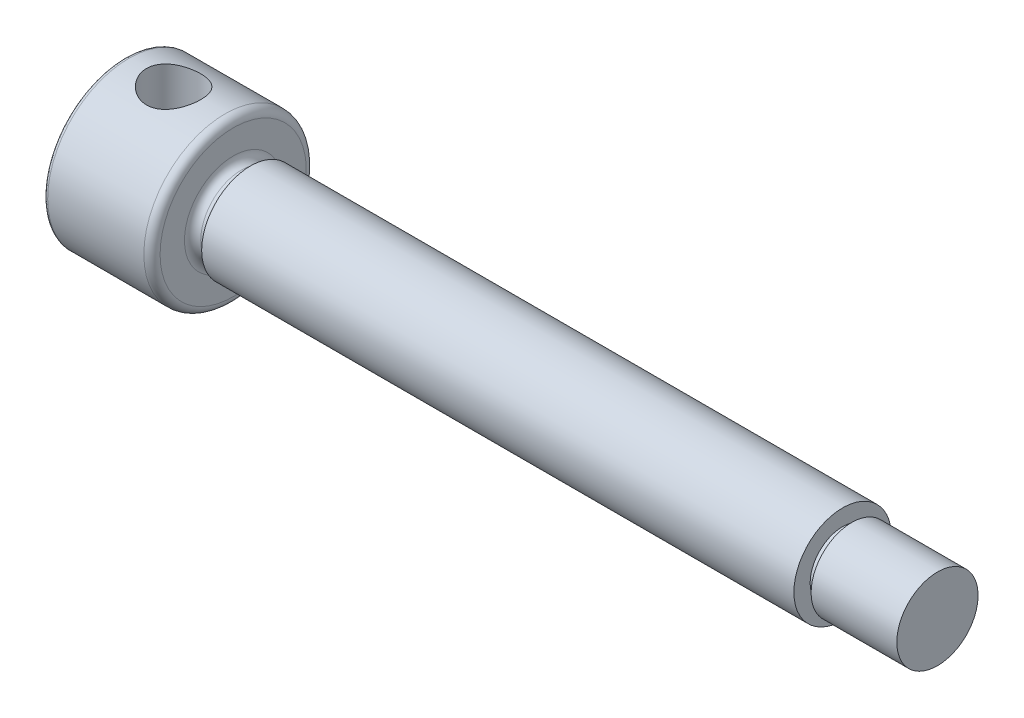
ISO-10303-21;
HEADER;
FILE_DESCRIPTION(('STEP AP214'),'2;1');
FILE_NAME('part.step','',(''),(''),'','','');
FILE_SCHEMA(('AUTOMOTIVE_DESIGN { 1 0 10303 214 1 1 1 1 }'));
ENDSEC;
DATA;
#1=APPLICATION_CONTEXT('core data for automotive mechanical design processes');
#2=APPLICATION_PROTOCOL_DEFINITION('international standard','automotive_design',2000,#1);
#3=PRODUCT_CONTEXT('',#1,'mechanical');
#4=PRODUCT('Part','Part','',(#3));
#5=PRODUCT_RELATED_PRODUCT_CATEGORY('part','',(#4));
#6=PRODUCT_DEFINITION_FORMATION('','',#4);
#7=PRODUCT_DEFINITION_CONTEXT('part definition',#1,'design');
#8=PRODUCT_DEFINITION('design','',#6,#7);
#9=PRODUCT_DEFINITION_SHAPE('','',#8);
#10=(LENGTH_UNIT() NAMED_UNIT(*) SI_UNIT(.MILLI.,.METRE.));
#11=(NAMED_UNIT(*) PLANE_ANGLE_UNIT() SI_UNIT($,.RADIAN.));
#12=(NAMED_UNIT(*) SI_UNIT($,.STERADIAN.) SOLID_ANGLE_UNIT());
#13=UNCERTAINTY_MEASURE_WITH_UNIT(LENGTH_MEASURE(1.E-05),#10,'distance_accuracy_value','');
#14=(GEOMETRIC_REPRESENTATION_CONTEXT(3) GLOBAL_UNCERTAINTY_ASSIGNED_CONTEXT((#13)) GLOBAL_UNIT_ASSIGNED_CONTEXT((#10,
#11,#12)) REPRESENTATION_CONTEXT('',''));
#15=CARTESIAN_POINT('',(0.,0.,0.));
#16=DIRECTION('',(0.,0.,1.));
#17=DIRECTION('',(1.,0.,0.));
#18=AXIS2_PLACEMENT_3D('',#15,#16,#17);
#19=CARTESIAN_POINT('',(0.,0.,0.));
#20=DIRECTION('',(1.,0.,0.));
#21=DIRECTION('',(0.,0.,-1.));
#22=AXIS2_PLACEMENT_3D('',#19,#20,#21);
#23=PLANE('',#22);
#24=CARTESIAN_POINT('',(0.,0.,0.));
#25=DIRECTION('',(1.,0.,0.));
#26=DIRECTION('',(0.,0.,-1.));
#27=AXIS2_PLACEMENT_3D('',#24,#25,#26);
#28=CIRCLE('',#27,28.5);
#29=CARTESIAN_POINT('',(0.,0.,-28.5));
#30=VERTEX_POINT('',#29);
#31=EDGE_CURVE('E232',#30,#30,#28,.F.);
#32=ORIENTED_EDGE('',*,*,#31,.T.);
#33=EDGE_LOOP('',(#32));
#34=FACE_BOUND('',#33,.T.);
#35=ADVANCED_FACE('F35',(#34),#23,.F.);
#36=CARTESIAN_POINT('',(0.,0.,0.));
#37=DIRECTION('',(-1.,0.,0.));
#38=DIRECTION('',(0.,0.,1.));
#39=AXIS2_PLACEMENT_3D('',#36,#37,#38);
#40=CYLINDRICAL_SURFACE('',#39,30.);
#41=CARTESIAN_POINT('',(37.,0.,0.));
#42=DIRECTION('',(-1.,0.,0.));
#43=DIRECTION('',(0.,0.,1.));
#44=AXIS2_PLACEMENT_3D('',#41,#42,#43);
#45=CIRCLE('',#44,30.);
#46=CARTESIAN_POINT('',(37.,0.,30.));
#47=VERTEX_POINT('',#46);
#48=EDGE_CURVE('E10',#47,#47,#45,.T.);
#49=ORIENTED_EDGE('',*,*,#48,.T.);
#50=EDGE_LOOP('',(#49));
#51=FACE_BOUND('',#50,.T.);
#52=CARTESIAN_POINT('',(8.,-30.,0.));
#53=CARTESIAN_POINT('',(7.99999988953208,-30.0000000727974,0.272817421855649));
#54=CARTESIAN_POINT('',(8.01117334763326,-29.9962700139409,0.545633217756684));
#55=CARTESIAN_POINT('',(8.0557586041426,-29.9814525321439,1.08923625252841));
#56=CARTESIAN_POINT('',(8.08917022182376,-29.9703651689954,1.36002350786673));
#57=CARTESIAN_POINT('',(8.1779177625908,-29.9411347007489,1.89761112302447));
#58=CARTESIAN_POINT('',(8.23325538909208,-29.922991047455,2.16441117140915));
#59=CARTESIAN_POINT('',(8.36534816126873,-29.8801375011105,2.69211184449215));
#60=CARTESIAN_POINT('',(8.44210345239371,-29.8554275634677,2.95301242911357));
#61=CARTESIAN_POINT('',(8.61619732592768,-29.8001502927581,3.46664728525619));
#62=CARTESIAN_POINT('',(8.71349650977788,-29.769594181714,3.71939613546444));
#63=CARTESIAN_POINT('',(8.92801325890131,-29.7033758431392,4.2157054038381));
#64=CARTESIAN_POINT('',(9.04523819613181,-29.6677117265642,4.45926238037108));
#65=CARTESIAN_POINT('',(9.29868677980414,-29.5921987127881,4.93557741320287));
#66=CARTESIAN_POINT('',(9.43490932188156,-29.5523500588748,5.16833609617821));
#67=CARTESIAN_POINT('',(9.72540947719081,-29.4694667799179,5.62171195987546));
#68=CARTESIAN_POINT('',(9.8796881758341,-29.4264319634014,5.84232840951691));
#69=CARTESIAN_POINT('',(10.2103752752822,-29.3368734013662,6.27682953459761));
#70=CARTESIAN_POINT('',(10.3873240119938,-29.2902826885599,6.49028930660537));
#71=CARTESIAN_POINT('',(10.7582003991746,-29.1960870485027,6.90166928730257));
#72=CARTESIAN_POINT('',(10.9521283328242,-29.1484821043462,7.09958923671302));
#73=CARTESIAN_POINT('',(11.355812801552,-29.0535150777194,7.4787345360743));
#74=CARTESIAN_POINT('',(11.5655729351135,-29.0061530530903,7.65995606974808));
#75=CARTESIAN_POINT('',(11.9996166986156,-28.9129673550339,8.00450980543821));
#76=CARTESIAN_POINT('',(12.2238999570906,-28.8671436423059,8.16784246472038));
#77=CARTESIAN_POINT('',(12.692372379013,-28.7770145745701,8.48001162237398));
#78=CARTESIAN_POINT('',(12.9369505911685,-28.7327920322828,8.6282889771903));
#79=CARTESIAN_POINT('',(13.438392048547,-28.6486860707732,8.90356690608016));
#80=CARTESIAN_POINT('',(13.6952503938753,-28.6088009413422,9.0305758768566));
#81=CARTESIAN_POINT('',(14.2196006633893,-28.534611919855,9.26232893823766));
#82=CARTESIAN_POINT('',(14.4870922834922,-28.5003078683376,9.36707366499655));
#83=CARTESIAN_POINT('',(15.0307959475433,-28.4384115850147,9.55334459189201));
#84=CARTESIAN_POINT('',(15.307007598401,-28.4108190511471,9.63487183699472));
#85=CARTESIAN_POINT('',(15.8566360788065,-28.3640896180245,9.77156399073686));
#86=CARTESIAN_POINT('',(16.1298335086424,-28.3446991444855,9.82752458111658));
#87=CARTESIAN_POINT('',(16.680382822344,-28.3137046439995,9.91646893957756));
#88=CARTESIAN_POINT('',(16.957734619799,-28.3021004553276,9.94945318488935));
#89=CARTESIAN_POINT('',(17.5143726936581,-28.2870721491151,9.99210001297699));
#90=CARTESIAN_POINT('',(17.7936584332203,-28.2836458461098,10.001768826595));
#91=CARTESIAN_POINT('',(18.3520337599248,-28.2850842635986,9.99770051099411));
#92=CARTESIAN_POINT('',(18.6311233523796,-28.2899487501436,9.98396404222416));
#93=CARTESIAN_POINT('',(19.1741814428839,-28.3073918779751,9.93439524598055));
#94=CARTESIAN_POINT('',(19.4382573732821,-28.319607253905,9.89960301642487));
#95=CARTESIAN_POINT('',(19.9623784110368,-28.3510582066347,9.80916853998117));
#96=CARTESIAN_POINT('',(20.222423659293,-28.3702935374598,9.7535270236365));
#97=CARTESIAN_POINT('',(20.7367087518509,-28.4152063218622,9.62189570023088));
#98=CARTESIAN_POINT('',(20.990949140867,-28.4408831682495,9.54590781101341));
#99=CARTESIAN_POINT('',(21.4921119032636,-28.4979443617719,9.37418519909552));
#100=CARTESIAN_POINT('',(21.7390314559328,-28.529330876437,9.27844297530627));
#101=CARTESIAN_POINT('',(22.227762932081,-28.5974561704828,9.0663166164916));
#102=CARTESIAN_POINT('',(22.4694335832997,-28.6342713183779,8.94963170239518));
#103=CARTESIAN_POINT('',(22.9422102010314,-28.7118622802787,8.69749161241992));
#104=CARTESIAN_POINT('',(23.1733125218741,-28.7526394460964,8.56203002330161));
#105=CARTESIAN_POINT('',(23.6235621932746,-28.8370515032613,8.27327503440926));
#106=CARTESIAN_POINT('',(23.8427087177596,-28.8806865916162,8.11998040476689));
#107=CARTESIAN_POINT('',(24.2678135246711,-28.9696785669952,7.79652835236897));
#108=CARTESIAN_POINT('',(24.4737713533684,-29.0150355131707,7.62637034997736));
#109=CARTESIAN_POINT('',(24.8817825415933,-29.1087179470552,7.26085153575986));
#110=CARTESIAN_POINT('',(25.0830648689424,-29.1570743820817,7.06463704194718));
#111=CARTESIAN_POINT('',(25.468419581959,-29.2530762745549,6.65594240213113));
#112=CARTESIAN_POINT('',(25.6524973709351,-29.300721951247,6.44346740133943));
#113=CARTESIAN_POINT('',(26.002391927978,-29.3940440756636,6.00339730644672));
#114=CARTESIAN_POINT('',(26.1681999651747,-29.4397195755768,5.77579506581797));
#115=CARTESIAN_POINT('',(26.4802271262773,-29.5278149211553,5.30706897712641));
#116=CARTESIAN_POINT('',(26.6264540009262,-29.5702360521294,5.06595053306834));
#117=CARTESIAN_POINT('',(26.8996756365008,-29.6510879634885,4.56913058063747));
#118=CARTESIAN_POINT('',(27.0264594786625,-29.6894737298341,4.31330561219176));
#119=CARTESIAN_POINT('',(27.2579286435293,-29.7606637721347,3.79108523456436));
#120=CARTESIAN_POINT('',(27.3626136833176,-29.7934679766314,3.5246896901062));
#121=CARTESIAN_POINT('',(27.5489114728507,-29.8525359450835,2.98332200960532));
#122=CARTESIAN_POINT('',(27.6305307217331,-29.8788015511394,2.70835231375461));
#123=CARTESIAN_POINT('',(27.7699439963879,-29.92402797464,2.15185145897869));
#124=CARTESIAN_POINT('',(27.8277391187149,-29.9429891282845,1.87032060267474));
#125=CARTESIAN_POINT('',(27.9169416237236,-29.9723879768698,1.31523069421226));
#126=CARTESIAN_POINT('',(27.949384632254,-29.9831596368278,1.04185537514999));
#127=CARTESIAN_POINT('',(27.9916207141038,-29.9972012675858,0.493170936320487));
#128=CARTESIAN_POINT('',(28.0014144429116,-30.0004714554843,0.217861872748687));
#129=CARTESIAN_POINT('',(27.9982566168389,-29.9994188985649,-0.332568031007714));
#130=CARTESIAN_POINT('',(27.9853084885021,-29.9950972976112,-0.607688893300788));
#131=CARTESIAN_POINT('',(27.9368007790837,-29.9789840848464,-1.15570622136198));
#132=CARTESIAN_POINT('',(27.9012414263449,-29.9671925484717,-1.42860270956509));
#133=CARTESIAN_POINT('',(27.8092212178968,-29.9369169558084,-1.96222703239709));
#134=CARTESIAN_POINT('',(27.7534012879386,-29.9186384657949,-2.22307746287106));
#135=CARTESIAN_POINT('',(27.6212424490562,-29.8758162932983,-2.7390974709425));
#136=CARTESIAN_POINT('',(27.5448962364019,-29.8512703808768,-2.99426499136465));
#137=CARTESIAN_POINT('',(27.372353671038,-29.7965488926633,-3.49708740595829));
#138=CARTESIAN_POINT('',(27.2761629395045,-29.7663749113147,-3.74474440483059));
#139=CARTESIAN_POINT('',(27.0646297287938,-29.7011345010077,-4.23117712889609));
#140=CARTESIAN_POINT('',(26.949279883177,-29.6660661910728,-4.46994939463069));
#141=CARTESIAN_POINT('',(26.6970680134605,-29.5909467676433,-4.94315066961522));
#142=CARTESIAN_POINT('',(26.5597265196904,-29.5507901885031,-5.17730735950409));
#143=CARTESIAN_POINT('',(26.2667077422935,-29.4672484943862,-5.63338688490355));
#144=CARTESIAN_POINT('',(26.1110222669026,-29.423861940227,-5.85530418930658));
#145=CARTESIAN_POINT('',(25.7823833401819,-29.3349700920827,-6.28552190327163));
#146=CARTESIAN_POINT('',(25.6094291082486,-29.2894647023692,-6.49382169657322));
#147=CARTESIAN_POINT('',(25.2473266894755,-29.1974842079415,-6.89560723699441));
#148=CARTESIAN_POINT('',(25.058178079085,-29.1510090778886,-7.08909259640374));
#149=CARTESIAN_POINT('',(24.6558052970706,-29.0561491129105,-7.46861368298098));
#150=CARTESIAN_POINT('',(24.4418759616025,-29.007774048611,-7.65390507082137));
#151=CARTESIAN_POINT('',(23.998946278955,-28.9126373623233,-8.00578656049348));
#152=CARTESIAN_POINT('',(23.7699513580659,-28.865875168565,-8.17238333784561));
#153=CARTESIAN_POINT('',(23.2981425426263,-28.7752794226619,-8.48586679285762));
#154=CARTESIAN_POINT('',(23.0553227096649,-28.7314471468913,-8.63274490811907));
#155=CARTESIAN_POINT('',(22.5576069978411,-28.6480650290242,-8.90554413202635));
#156=CARTESIAN_POINT('',(22.3027162253495,-28.6085133989423,-9.03147400245094));
#157=CARTESIAN_POINT('',(21.7829217693998,-28.5349686573375,-9.26121465963451));
#158=CARTESIAN_POINT('',(21.5180366694526,-28.5009658003202,-9.36506432595329));
#159=CARTESIAN_POINT('',(20.9796830041944,-28.4395326253181,-9.54999948685702));
#160=CARTESIAN_POINT('',(20.7062144099305,-28.4121023295056,-9.63108490464717));
#161=CARTESIAN_POINT('',(20.1528332282205,-28.364744570705,-9.76967941183168));
#162=CARTESIAN_POINT('',(19.8729231132068,-28.3448142783458,-9.82719739275427));
#163=CARTESIAN_POINT('',(19.308757651123,-28.3131339062987,-9.91810350429491));
#164=CARTESIAN_POINT('',(19.0245025237703,-28.301383414366,-9.95149285094855));
#165=CARTESIAN_POINT('',(18.4686336163421,-28.2868595572535,-9.99269827789952));
#166=CARTESIAN_POINT('',(18.1971213073097,-28.2836556970276,-10.0017409386727));
#167=CARTESIAN_POINT('',(17.6542875047189,-28.2850819532403,-9.99770707019235));
#168=CARTESIAN_POINT('',(17.3829660046552,-28.2897117882182,-9.98463133564125));
#169=CARTESIAN_POINT('',(16.8425445147554,-28.3066557004955,-9.9364928064115));
#170=CARTESIAN_POINT('',(16.573444387558,-28.3189692989986,-9.90143138172029));
#171=CARTESIAN_POINT('',(16.0394036229578,-28.3508886380516,-9.80966197710057));
#172=CARTESIAN_POINT('',(15.7744629988566,-28.3704944019159,-9.75295392796379));
#173=CARTESIAN_POINT('',(15.2556454290189,-28.4159458608578,-9.61971250162803));
#174=CARTESIAN_POINT('',(15.0016536903119,-28.441664218809,-9.54358162889864));
#175=CARTESIAN_POINT('',(14.5009969450934,-28.498791950436,-9.3716093890319));
#176=CARTESIAN_POINT('',(14.2543345742507,-28.5302033431982,-9.27576102727379));
#177=CARTESIAN_POINT('',(13.76993896805,-28.597830166649,-9.0651164728258));
#178=CARTESIAN_POINT('',(13.5322054266378,-28.6340454324816,-8.95032093031891));
#179=CARTESIAN_POINT('',(13.0670154470979,-28.7103060608169,-8.7025924785274));
#180=CARTESIAN_POINT('',(12.839559710351,-28.7503516841324,-8.56965833390417));
#181=CARTESIAN_POINT('',(12.3865184745863,-28.8350396975525,-8.28034879297643));
#182=CARTESIAN_POINT('',(12.1614474590516,-28.8798064098721,-8.12320375674414));
#183=CARTESIAN_POINT('',(11.725203644449,-28.9711505527338,-7.791153864974));
#184=CARTESIAN_POINT('',(11.5140311741309,-29.0177280260653,-7.61624858959245));
#185=CARTESIAN_POINT('',(11.1067657786475,-29.1114649338633,-7.24971676169647));
#186=CARTESIAN_POINT('',(10.9106769568121,-29.1586245226669,-7.0580856891776));
#187=CARTESIAN_POINT('',(10.5348203256367,-29.2522781356485,-6.65929199916924));
#188=CARTESIAN_POINT('',(10.3550523099677,-29.2987721682343,-6.45212957808883));
#189=CARTESIAN_POINT('',(10.0062342556556,-29.3916811895353,-6.015057656916));
#190=CARTESIAN_POINT('',(9.83788230093786,-29.4380213798086,-5.78457436071791));
#191=CARTESIAN_POINT('',(9.52129093162154,-29.5273677523704,-5.30969823861296));
#192=CARTESIAN_POINT('',(9.37304398216467,-29.5703751810909,-5.06531067269805));
#193=CARTESIAN_POINT('',(9.0977371765883,-29.6518631526816,-4.56414864864736));
#194=CARTESIAN_POINT('',(8.97067741446286,-29.6903436754686,-4.30737413556508));
#195=CARTESIAN_POINT('',(8.7388217940404,-29.7616741137116,-3.78321180102571));
#196=CARTESIAN_POINT('',(8.63402478280127,-29.7945243207331,-3.51582453003312));
#197=CARTESIAN_POINT('',(8.45180775296722,-29.8523172984574,-2.98451649561972));
#198=CARTESIAN_POINT('',(8.37337384086431,-29.877547765761,-2.72097451656309));
#199=CARTESIAN_POINT('',(8.23838408200701,-29.9213145214249,-2.18780019401329));
#200=CARTESIAN_POINT('',(8.18182751717194,-29.9398510294998,-1.91816805072525));
#201=CARTESIAN_POINT('',(8.09113042082144,-29.9697157235778,-1.37482625392579));
#202=CARTESIAN_POINT('',(8.05698471352922,-29.9810455739363,-1.10111755683676));
#203=CARTESIAN_POINT('',(8.01141959025543,-29.9961876649972,-0.551605348742874));
#204=CARTESIAN_POINT('',(8.00000011167636,-29.9999999264062,-0.275801843510097));
#205=CARTESIAN_POINT('',(8.,-30.,0.));
#206=B_SPLINE_CURVE_WITH_KNOTS('',3,(#52,#53,#54,#55,#56,#57,#58,#59,#60,#61,#62,#63,#64,#65,
#66,#67,#68,#69,#70,#71,#72,#73,#74,#75,#76,#77,#78,#79,#80,#81,#82,#83,#84,#85,#86,#87,#88,#89,
#90,#91,#92,#93,#94,#95,#96,#97,#98,#99,#100,#101,#102,#103,#104,#105,#106,#107,#108,#109,#110,
#111,#112,#113,#114,#115,#116,#117,#118,#119,#120,#121,#122,#123,#124,#125,#126,#127,#128,#129,
#130,#131,#132,#133,#134,#135,#136,#137,#138,#139,#140,#141,#142,#143,#144,#145,#146,#147,#148,
#149,#150,#151,#152,#153,#154,#155,#156,#157,#158,#159,#160,#161,#162,#163,#164,#165,#166,#167,
#168,#169,#170,#171,#172,#173,#174,#175,#176,#177,#178,#179,#180,#181,#182,#183,#184,#185,#186,
#187,#188,#189,#190,#191,#192,#193,#194,#195,#196,#197,#198,#199,#200,#201,#202,#203,#204,#205),
.UNSPECIFIED.,.T.,.F.,(4,2,2,2,2,2,2,2,2,2,2,2,2,2,2,2,2,2,2,2,2,2,2,2,2,2,2,2,2,2,2,2,2,2,2,2,
2,2,2,2,2,2,2,2,2,2,2,2,2,2,2,2,2,2,2,2,2,2,2,2,2,2,2,2,2,2,2,2,2,2,2,2,2,2,2,2,4),(0.,
0.818196432007471,1.6363862147065,2.45463957443219,3.27289849113841,4.08960219775423,
4.90660872161766,5.72356777122698,6.54057595602183,7.38307938747213,8.22559687294596,
9.06830643331703,9.91099444776757,10.7781693377685,11.645001058067,12.5118080071298,
13.3785759370122,14.2161395744967,15.0536858148334,15.8910082035541,16.7283069651494,
17.5272827763208,18.3262305945964,19.1251031307666,19.9242795738385,20.7360167087683,
21.5480317816989,22.3601028890635,23.1722019190185,24.0268844717706,24.881297691995,
25.7361174700155,26.590597881189,27.453776210577,28.3169655900159,29.1799115096585,
30.0428177059962,30.8683037091444,31.6937658217619,32.5191035716477,33.3444329868686,
34.1456526351705,34.9471577542856,35.7484361493029,36.5500233420392,37.3723552433202,
38.1950557703192,39.0177935028915,39.8405527600735,40.7009055318267,41.5609501023284,
42.4213669287557,43.2814229688246,44.1399518163629,44.998483560099,45.8566910978631,
46.7148553806428,47.5288973096875,48.3429099912534,49.1568719545403,49.9708365202357,
50.7691377037427,51.5677225680383,52.3662800341472,53.1648919135846,53.9983437551269,
54.831815303668,55.665512792355,56.4991997398996,57.3656243250608,58.2317232930636,
59.0978261032941,59.9638840489003,60.7912515257116,61.618591843516,62.4457410201728,
63.2728879185129),.UNSPECIFIED.);
#207=CARTESIAN_POINT('',(8.,-30.,0.));
#208=VERTEX_POINT('',#207);
#209=EDGE_CURVE('E55',#208,#208,#206,.T.);
#210=ORIENTED_EDGE('',*,*,#209,.T.);
#211=EDGE_LOOP('',(#210));
#212=FACE_BOUND('',#211,.T.);
#213=CARTESIAN_POINT('',(18.,28.2842712474619,10.));
#214=CARTESIAN_POINT('',(17.7276581205516,28.2842711586537,10.0000001140375));
#215=CARTESIAN_POINT('',(17.4553178986335,28.2882153633986,9.9888652489343));
#216=CARTESIAN_POINT('',(16.9126798430066,28.303863864854,9.94443775454981));
#217=CARTESIAN_POINT('',(16.6423819945745,28.3155681055686,9.91114528515616));
#218=CARTESIAN_POINT('',(16.1057789539502,28.3463631817862,9.82272262727793));
#219=CARTESIAN_POINT('',(15.8394742907853,28.3654549871867,9.76758957136717));
#220=CARTESIAN_POINT('',(15.3127774859928,28.4104260085242,9.63600126034046));
#221=CARTESIAN_POINT('',(15.0523853952237,28.4363052828214,9.55954582188961));
#222=CARTESIAN_POINT('',(14.5398350149698,28.4939998192804,9.38617562291735));
#223=CARTESIAN_POINT('',(14.2876599029785,28.5258019239445,9.28930615037564));
#224=CARTESIAN_POINT('',(13.7924541258351,28.594462376809,9.07575323466854));
#225=CARTESIAN_POINT('',(13.5494268956466,28.6313226006317,8.95906243763902));
#226=CARTESIAN_POINT('',(13.0740871949252,28.7090513785684,8.70676649822041));
#227=CARTESIAN_POINT('',(12.8417743213727,28.749919781734,8.57116206803914));
#228=CARTESIAN_POINT('',(12.389180388752,28.8345602147077,8.28195822303536));
#229=CARTESIAN_POINT('',(12.1689000649571,28.8783324215975,8.12835771032555));
#230=CARTESIAN_POINT('',(11.7340276032924,28.969218118448,7.79837866412599));
#231=CARTESIAN_POINT('',(11.5199153303064,29.0163950635917,7.62138490453671));
#232=CARTESIAN_POINT('',(11.1072172650086,29.1113399914068,7.25028001156653));
#233=CARTESIAN_POINT('',(10.9086317688827,29.1591079853326,7.05616855180183));
#234=CARTESIAN_POINT('',(10.5281737936366,29.2539610336928,6.65198113288573));
#235=CARTESIAN_POINT('',(10.3463042349956,29.3010459675826,6.44190239572425));
#236=CARTESIAN_POINT('',(10.000492561338,29.3932703717309,6.0070826819757));
#237=CARTESIAN_POINT('',(9.8365499108607,29.4384099000727,5.78234214364378));
#238=CARTESIAN_POINT('',(9.52362737822774,29.5266957482027,5.31343875376167));
#239=CARTESIAN_POINT('',(9.37515663678149,29.5697580123815,5.06891983241566));
#240=CARTESIAN_POINT('',(9.09948783133647,29.6513369329531,4.56756881728998));
#241=CARTESIAN_POINT('',(8.97228137281794,29.6898553813362,4.31074163421873));
#242=CARTESIAN_POINT('',(8.74014038165972,29.7612633479985,3.78644812030808));
#243=CARTESIAN_POINT('',(8.63520586041246,29.7941528633985,3.51898178402668));
#244=CARTESIAN_POINT('',(8.44856855514592,29.8533415547454,2.9753549518802));
#245=CARTESIAN_POINT('',(8.36686477640222,29.8796410128683,2.69919482883969));
#246=CARTESIAN_POINT('',(8.2299063140535,29.9240820045263,2.15001211988424));
#247=CARTESIAN_POINT('',(8.17383037114042,29.9424755162849,1.87721461619439));
#248=CARTESIAN_POINT('',(8.08459442866948,29.9718782846619,1.32750200396552));
#249=CARTESIAN_POINT('',(8.05143394528089,29.982887697186,1.05058698248877));
#250=CARTESIAN_POINT('',(8.00836233043324,29.997206705667,0.494817637017562));
#251=CARTESIAN_POINT('',(7.99844604538711,30.0005180084087,0.215963756651259));
#252=CARTESIAN_POINT('',(8.0019484307839,29.9993505006877,-0.341577814177328));
#253=CARTESIAN_POINT('',(8.01536656097237,29.9948718705828,-0.620265508337829));
#254=CARTESIAN_POINT('',(8.06441572373642,29.9785811916691,-1.16440400781504));
#255=CARTESIAN_POINT('',(8.09915350420608,29.9670641183686,-1.42994475599843));
#256=CARTESIAN_POINT('',(8.18971915313361,29.9372641152287,-1.95700946299872));
#257=CARTESIAN_POINT('',(8.24554637009403,29.9189813943948,-2.21853354563925));
#258=CARTESIAN_POINT('',(8.37779040466862,29.8761277515145,-2.73574967788116));
#259=CARTESIAN_POINT('',(8.4542043079853,29.8515577195385,-2.99144254740938));
#260=CARTESIAN_POINT('',(8.62701878278343,29.7967458585561,-3.49545812020526));
#261=CARTESIAN_POINT('',(8.72342692853685,29.7665018805458,-3.74377798954212));
#262=CARTESIAN_POINT('',(8.93680820054453,29.7006905364675,-4.2345072896593));
#263=CARTESIAN_POINT('',(9.05402775379812,29.6650602399235,-4.47680106526091));
#264=CARTESIAN_POINT('',(9.3073403037484,29.5896554948147,-4.95074703653144));
#265=CARTESIAN_POINT('',(9.44344025939855,29.5498795195829,-5.18239526635339));
#266=CARTESIAN_POINT('',(9.73354165652315,29.467185279309,-5.63361428175612));
#267=CARTESIAN_POINT('',(9.88754386331474,29.4242668799581,-5.85318455041525));
#268=CARTESIAN_POINT('',(10.2124529945616,29.3363500324178,-6.27899992233789));
#269=CARTESIAN_POINT('',(10.3833605344722,29.2913515085312,-6.4852445400158));
#270=CARTESIAN_POINT('',(10.7495187844428,29.198230563107,-6.89268066334409));
#271=CARTESIAN_POINT('',(10.9455389467558,29.150061110167,-7.09317055422096));
#272=CARTESIAN_POINT('',(11.3536599386931,29.0539933119105,-7.47693750407163));
#273=CARTESIAN_POINT('',(11.5657540518105,29.0060948622484,-7.66022168157001));
#274=CARTESIAN_POINT('',(12.0049246352993,28.911847334422,-8.00859996283032));
#275=CARTESIAN_POINT('',(12.2320097342935,28.8654991721175,-8.17368344194966));
#276=CARTESIAN_POINT('',(12.6995669333151,28.775718676331,-8.4843478027125));
#277=CARTESIAN_POINT('',(12.9400336730947,28.7322851904866,-8.62993641488595));
#278=CARTESIAN_POINT('',(13.4365720631663,28.64898095839,-8.90261331003136));
#279=CARTESIAN_POINT('',(13.6928215197093,28.6091721838022,-9.02939717143143));
#280=CARTESIAN_POINT('',(14.2158114303334,28.5351208009343,-9.26075808434889));
#281=CARTESIAN_POINT('',(14.4825474741002,28.5008758831323,-9.36534435549717));
#282=CARTESIAN_POINT('',(15.0246804408807,28.439058164449,-9.55141833409385));
#283=CARTESIAN_POINT('',(15.300076245655,28.4114845060698,-9.63290901039166));
#284=CARTESIAN_POINT('',(15.8574765935899,28.3639441097449,-9.77200545725044));
#285=CARTESIAN_POINT('',(16.1394807951245,28.3439769794908,-9.8296124596308));
#286=CARTESIAN_POINT('',(16.6950265326232,28.3130630141317,-9.91829437201929));
#287=CARTESIAN_POINT('',(16.9683756354829,28.3017497645433,-9.95044933424631));
#288=CARTESIAN_POINT('',(17.5170049236136,28.287066021394,-9.99211639711498));
#289=CARTESIAN_POINT('',(17.7922850506128,28.2836952891803,-10.0016291780981));
#290=CARTESIAN_POINT('',(18.3426259785251,28.2850080810155,-9.9979157921081));
#291=CARTESIAN_POINT('',(18.6176868077929,28.2896902973743,-9.98469331703369));
#292=CARTESIAN_POINT('',(19.1655325047764,28.3069515740732,-9.9356512804711));
#293=CARTESIAN_POINT('',(19.4383174004328,28.3195305373233,-9.89983199680915));
#294=CARTESIAN_POINT('',(19.9701957432488,28.3516074081319,-9.80758102183027));
#295=CARTESIAN_POINT('',(20.2294362986685,28.3708507880741,-9.75190561796518));
#296=CARTESIAN_POINT('',(20.7422504825032,28.4157468336444,-9.62029948519906));
#297=CARTESIAN_POINT('',(20.9958220688485,28.4414017695639,-9.54436158082835));
#298=CARTESIAN_POINT('',(21.4955200467818,28.4983692386223,-9.37289185459438));
#299=CARTESIAN_POINT('',(21.7416482010731,28.529680419844,-9.27736471408097));
#300=CARTESIAN_POINT('',(22.2251262245716,28.597103970113,-9.0674030758055));
#301=CARTESIAN_POINT('',(22.4624726582105,28.6332181933345,-8.95296127203323));
#302=CARTESIAN_POINT('',(22.9341985523174,28.710459557941,-8.70214104644034));
#303=CARTESIAN_POINT('',(23.1682526811428,28.7517082135721,-8.56518817614671));
#304=CARTESIAN_POINT('',(23.6241981614388,28.8371535148024,-8.27295319484451));
#305=CARTESIAN_POINT('',(23.8460840041379,28.8813514758506,-8.11766288088269));
#306=CARTESIAN_POINT('',(24.2763243183689,28.9715031084024,-7.78979500724484));
#307=CARTESIAN_POINT('',(24.4846782656837,29.0174568478141,-7.61721677850365));
#308=CARTESIAN_POINT('',(24.8866606994161,29.1099265934175,-7.25582239580804));
#309=CARTESIAN_POINT('',(25.0802888443388,29.1564426126195,-7.06700586549977));
#310=CARTESIAN_POINT('',(25.4606823819411,29.2510891603461,-6.66472112704177));
#311=CARTESIAN_POINT('',(25.6466625381762,29.2991889216562,-6.45050221786745));
#312=CARTESIAN_POINT('',(25.9998850592751,29.3933527827565,-6.00684695000576));
#313=CARTESIAN_POINT('',(26.1671341589068,29.4394176105782,-5.7774161083245));
#314=CARTESIAN_POINT('',(26.4818441893394,29.5282725260609,-5.30461980440384));
#315=CARTESIAN_POINT('',(26.6292973155185,29.5710613192953,-5.06124889988545));
#316=CARTESIAN_POINT('',(26.9031430914849,29.6521306466086,-4.56234364098345));
#317=CARTESIAN_POINT('',(27.029544604522,29.6904130759775,-4.30681446409061));
#318=CARTESIAN_POINT('',(27.2595694769911,29.7611781009394,-3.78690590920505));
#319=CARTESIAN_POINT('',(27.3633333823932,29.7936962331654,-3.52259360643662));
#320=CARTESIAN_POINT('',(27.5481804197701,29.8523040878082,-2.98545108537338));
#321=CARTESIAN_POINT('',(27.6292635263009,29.8783938030133,-2.71262085752324));
#322=CARTESIAN_POINT('',(27.7679560294572,29.9233798042343,-2.16055813778272));
#323=CARTESIAN_POINT('',(27.8255724384716,29.9422782390591,-1.88132758484045));
#324=CARTESIAN_POINT('',(27.9167857423612,29.9723335559029,-1.31856201646019));
#325=CARTESIAN_POINT('',(27.9503836713099,29.983490771206,-1.03502718687206));
#326=CARTESIAN_POINT('',(27.9922072880783,29.9973972888662,-0.479319262582849));
#327=CARTESIAN_POINT('',(28.0015521044861,30.0005173987915,-0.207239081052944));
#328=CARTESIAN_POINT('',(27.9980285258741,29.9993428126327,0.336755914294543));
#329=CARTESIAN_POINT('',(27.9851608722804,29.9950483640377,0.608670733328673));
#330=CARTESIAN_POINT('',(27.9373386444946,29.9791626520563,1.15030993875713));
#331=CARTESIAN_POINT('',(27.9023858611491,29.9675719803088,1.42003450095977));
#332=CARTESIAN_POINT('',(27.8107239716782,29.9374086079629,1.95536187856338));
#333=CARTESIAN_POINT('',(27.7540148097442,29.9188358894545,2.22096468338957));
#334=CARTESIAN_POINT('',(27.6204424464594,29.8755584356358,2.74194020770653));
#335=CARTESIAN_POINT('',(27.5439189419449,29.8509573983983,2.99740882399659));
#336=CARTESIAN_POINT('',(27.3709186286291,29.7960968484284,3.50096941131779));
#337=CARTESIAN_POINT('',(27.2744347103176,29.7658353199086,3.74905871787219));
#338=CARTESIAN_POINT('',(27.0622936966784,29.7004207309351,4.23620216269844));
#339=CARTESIAN_POINT('',(26.9466379555036,29.6652680159862,4.47525693763802));
#340=CARTESIAN_POINT('',(26.6969860204935,29.5909339126644,4.94294527905782));
#341=CARTESIAN_POINT('',(26.5629886398934,29.551752263647,5.1715781699306));
#342=CARTESIAN_POINT('',(26.2722891136436,29.4688081519004,5.62534353485783));
#343=CARTESIAN_POINT('',(26.1149312009223,29.4249299528017,5.85003487702622));
#344=CARTESIAN_POINT('',(25.7825368552063,29.3350010427051,6.2854712683555));
#345=CARTESIAN_POINT('',(25.6075000678302,29.2889502881672,6.49621603781054));
#346=CARTESIAN_POINT('',(25.2408008319197,29.1958514949471,6.90258840131868));
#347=CARTESIAN_POINT('',(25.0491333662471,29.148803158572,7.09821139954937));
#348=CARTESIAN_POINT('',(24.6503782321164,29.0549477346299,7.47310912970469));
#349=CARTESIAN_POINT('',(24.4432906953177,29.0081406450066,7.65238400118341));
#350=CARTESIAN_POINT('',(24.0064492984775,28.914186301541,8.00022249753155));
#351=CARTESIAN_POINT('',(23.7761236507691,28.8670984170591,8.16808498152002));
#352=CARTESIAN_POINT('',(23.3016599974583,28.7759175566601,8.48372301205399));
#353=CARTESIAN_POINT('',(23.0575271910851,28.7318234669818,8.63150604933305));
#354=CARTESIAN_POINT('',(22.5569422782481,28.6479466892045,8.90593894197784));
#355=CARTESIAN_POINT('',(22.3004901622871,28.6081640044294,9.03258878105097));
#356=CARTESIAN_POINT('',(21.7770026470693,28.5341661028133,9.26369799840207));
#357=CARTESIAN_POINT('',(21.5099678160876,28.4999505875266,9.36815856629792));
#358=CARTESIAN_POINT('',(20.9794854850593,28.439603815985,9.54974733148494));
#359=CARTESIAN_POINT('',(20.7164212091995,28.4131771013528,9.62789736827417));
#360=CARTESIAN_POINT('',(20.1841866002075,28.3672416792722,9.76241059985781));
#361=CARTESIAN_POINT('',(19.9150164794795,28.3477327315668,9.81877455129849));
#362=CARTESIAN_POINT('',(19.3725923231067,28.3162626414065,9.90916574585984));
#363=CARTESIAN_POINT('',(19.0993395035439,28.304299295539,9.94319950979858));
#364=CARTESIAN_POINT('',(18.5507238855652,28.2883036592247,9.98861653420382));
#365=CARTESIAN_POINT('',(18.27536109554,28.2842713372547,9.99999988469829));
#366=CARTESIAN_POINT('',(18.,28.2842712474619,10.));
#367=B_SPLINE_CURVE_WITH_KNOTS('',3,(#213,#214,#215,#216,#217,#218,#219,#220,#221,#222,#223,
#224,#225,#226,#227,#228,#229,#230,#231,#232,#233,#234,#235,#236,#237,#238,#239,#240,#241,#242,
#243,#244,#245,#246,#247,#248,#249,#250,#251,#252,#253,#254,#255,#256,#257,#258,#259,#260,#261,
#262,#263,#264,#265,#266,#267,#268,#269,#270,#271,#272,#273,#274,#275,#276,#277,#278,#279,#280,
#281,#282,#283,#284,#285,#286,#287,#288,#289,#290,#291,#292,#293,#294,#295,#296,#297,#298,#299,
#300,#301,#302,#303,#304,#305,#306,#307,#308,#309,#310,#311,#312,#313,#314,#315,#316,#317,#318,
#319,#320,#321,#322,#323,#324,#325,#326,#327,#328,#329,#330,#331,#332,#333,#334,#335,#336,#337,
#338,#339,#340,#341,#342,#343,#344,#345,#346,#347,#348,#349,#350,#351,#352,#353,#354,#355,#356,
#357,#358,#359,#360,#361,#362,#363,#364,#365,#366),.UNSPECIFIED.,.T.,.F.,(4,2,2,2,2,2,2,2,2,2,2,
2,2,2,2,2,2,2,2,2,2,2,2,2,2,2,2,2,2,2,2,2,2,2,2,2,2,2,2,2,2,2,2,2,2,2,2,2,2,2,2,2,2,2,2,2,2,2,2,
2,2,2,2,2,2,2,2,2,2,2,2,2,2,2,2,2,4),(0.,0.816768059607214,1.63353022553851,2.4503996588184,
3.26727611595184,4.08235908130451,4.89774511187016,5.71310044671446,6.52850554988107,
7.37286999592244,8.21725054497379,9.06177833834293,9.90628089953094,10.7730733994816,
11.6395229027309,12.5059728491808,13.3723856892507,14.208656653563,15.0449099605402,
15.8809778400841,16.7170263626666,17.5202339571185,18.3234167408122,19.1264858838399,
19.9298598051697,20.74347212296,21.5573851233426,22.3713329311248,23.1853103823888,
24.0378278398089,24.889991015934,25.7426490367816,26.5949679354003,27.459853568185,
28.3243792700685,29.1887937900586,30.0531637216384,30.8785251225923,31.7038617231671,
32.5290643128742,33.3542567569691,34.1508897973456,34.9478053211232,35.7445306229922,
36.5415643916546,37.3635426098909,38.1858899294866,39.0082690873153,39.8306673105009,
40.6928533438219,41.5547283753545,42.4169422120339,43.2787921126043,44.1351284875122,
44.9914658230858,45.8475470772925,46.7035914722059,47.5193689812693,48.3351192611683,
49.1508034017132,49.9664896346322,50.7690241262024,51.5718449585706,52.3746091098772,
53.1774252272562,54.009891165582,54.8423737943937,55.6751084453734,56.507835987135,
57.3734004329109,58.2386410839164,59.1038824019739,59.9690773207395,60.795173483065,
61.621240951903,62.44706708663,63.2728899389621),.UNSPECIFIED.);
#368=CARTESIAN_POINT('',(18.,28.2842712474619,10.));
#369=VERTEX_POINT('',#368);
#370=EDGE_CURVE('E63',#369,#369,#367,.T.);
#371=ORIENTED_EDGE('',*,*,#370,.T.);
#372=EDGE_LOOP('',(#371));
#373=FACE_BOUND('',#372,.T.);
#374=CARTESIAN_POINT('',(1.5,0.,0.));
#375=DIRECTION('',(1.,0.,0.));
#376=DIRECTION('',(0.,0.,-1.));
#377=AXIS2_PLACEMENT_3D('',#374,#375,#376);
#378=CIRCLE('',#377,30.);
#379=CARTESIAN_POINT('',(1.5,0.,-30.));
#380=VERTEX_POINT('',#379);
#381=EDGE_CURVE('E230',#380,#380,#378,.T.);
#382=ORIENTED_EDGE('',*,*,#381,.T.);
#383=EDGE_LOOP('',(#382));
#384=FACE_BOUND('',#383,.T.);
#385=ADVANCED_FACE('F68',(#51,#212,#373,#384),#40,.T.);
#386=CARTESIAN_POINT('',(40.,30.,0.));
#387=DIRECTION('',(-1.,0.,0.));
#388=DIRECTION('',(0.,0.,1.));
#389=AXIS2_PLACEMENT_3D('',#386,#387,#388);
#390=PLANE('',#389);
#391=CARTESIAN_POINT('',(40.,0.,0.));
#392=DIRECTION('',(-1.,0.,0.));
#393=DIRECTION('',(0.,0.,1.));
#394=AXIS2_PLACEMENT_3D('',#391,#392,#393);
#395=CIRCLE('',#394,18.);
#396=CARTESIAN_POINT('',(40.,0.,18.));
#397=VERTEX_POINT('',#396);
#398=EDGE_CURVE('E46',#397,#397,#395,.T.);
#399=ORIENTED_EDGE('',*,*,#398,.T.);
#400=EDGE_LOOP('',(#399));
#401=FACE_BOUND('',#400,.T.);
#402=CARTESIAN_POINT('',(40.,0.,0.));
#403=DIRECTION('',(-1.,0.,0.));
#404=DIRECTION('',(0.,0.,1.));
#405=AXIS2_PLACEMENT_3D('',#402,#403,#404);
#406=CIRCLE('',#405,27.);
#407=CARTESIAN_POINT('',(40.,0.,27.));
#408=VERTEX_POINT('',#407);
#409=EDGE_CURVE('E50',#408,#408,#406,.F.);
#410=ORIENTED_EDGE('',*,*,#409,.T.);
#411=EDGE_LOOP('',(#410));
#412=FACE_BOUND('',#411,.T.);
#413=ADVANCED_FACE('F110',(#401,#412),#390,.F.);
#414=CARTESIAN_POINT('',(0.,0.,0.));
#415=DIRECTION('',(-1.,0.,0.));
#416=DIRECTION('',(0.,0.,1.));
#417=AXIS2_PLACEMENT_3D('',#414,#415,#416);
#418=CYLINDRICAL_SURFACE('',#417,15.);
#419=CARTESIAN_POINT('',(43.,0.,0.));
#420=DIRECTION('',(-1.,0.,0.));
#421=DIRECTION('',(0.,0.,1.));
#422=AXIS2_PLACEMENT_3D('',#419,#420,#421);
#423=CIRCLE('',#422,15.);
#424=CARTESIAN_POINT('',(43.,0.,15.));
#425=VERTEX_POINT('',#424);
#426=EDGE_CURVE('E42',#425,#425,#423,.F.);
#427=ORIENTED_EDGE('',*,*,#426,.T.);
#428=EDGE_LOOP('',(#427));
#429=FACE_BOUND('',#428,.T.);
#430=CARTESIAN_POINT('',(46.35,0.,0.));
#431=DIRECTION('',(-1.,0.,0.));
#432=DIRECTION('',(0.,0.,1.));
#433=AXIS2_PLACEMENT_3D('',#430,#431,#432);
#434=CIRCLE('',#433,15.);
#435=CARTESIAN_POINT('',(46.35,0.,15.));
#436=VERTEX_POINT('',#435);
#437=EDGE_CURVE('E233',#436,#436,#434,.T.);
#438=ORIENTED_EDGE('',*,*,#437,.T.);
#439=EDGE_LOOP('',(#438));
#440=FACE_BOUND('',#439,.T.);
#441=ADVANCED_FACE('F107',(#429,#440),#418,.T.);
#442=CARTESIAN_POINT('',(46.35,15.,0.));
#443=DIRECTION('',(1.,0.,0.));
#444=DIRECTION('',(0.,0.,-1.));
#445=AXIS2_PLACEMENT_3D('',#442,#443,#444);
#446=PLANE('',#445);
#447=ORIENTED_EDGE('',*,*,#437,.F.);
#448=EDGE_LOOP('',(#447));
#449=FACE_BOUND('',#448,.T.);
#450=CARTESIAN_POINT('',(46.35,0.,0.));
#451=DIRECTION('',(-1.,0.,0.));
#452=DIRECTION('',(0.,0.,1.));
#453=AXIS2_PLACEMENT_3D('',#450,#451,#452);
#454=CIRCLE('',#453,18.);
#455=CARTESIAN_POINT('',(46.35,0.,18.));
#456=VERTEX_POINT('',#455);
#457=EDGE_CURVE('E236',#456,#456,#454,.T.);
#458=ORIENTED_EDGE('',*,*,#457,.T.);
#459=EDGE_LOOP('',(#458));
#460=FACE_BOUND('',#459,.T.);
#461=ADVANCED_FACE('F103',(#449,#460),#446,.F.);
#462=CARTESIAN_POINT('',(0.,0.,0.));
#463=DIRECTION('',(-1.,0.,0.));
#464=DIRECTION('',(0.,0.,1.));
#465=AXIS2_PLACEMENT_3D('',#462,#463,#464);
#466=CYLINDRICAL_SURFACE('',#465,18.);
#467=ORIENTED_EDGE('',*,*,#457,.F.);
#468=EDGE_LOOP('',(#467));
#469=FACE_BOUND('',#468,.T.);
#470=CARTESIAN_POINT('',(265.,0.,0.));
#471=DIRECTION('',(-1.,0.,0.));
#472=DIRECTION('',(0.,0.,1.));
#473=AXIS2_PLACEMENT_3D('',#470,#471,#472);
#474=CIRCLE('',#473,18.);
#475=CARTESIAN_POINT('',(265.,0.,18.));
#476=VERTEX_POINT('',#475);
#477=EDGE_CURVE('E241',#476,#476,#474,.T.);
#478=ORIENTED_EDGE('',*,*,#477,.T.);
#479=EDGE_LOOP('',(#478));
#480=FACE_BOUND('',#479,.T.);
#481=ADVANCED_FACE('F99',(#469,#480),#466,.T.);
#482=CARTESIAN_POINT('',(265.,18.,0.));
#483=DIRECTION('',(-1.,0.,0.));
#484=DIRECTION('',(0.,0.,1.));
#485=AXIS2_PLACEMENT_3D('',#482,#483,#484);
#486=PLANE('',#485);
#487=ORIENTED_EDGE('',*,*,#477,.F.);
#488=EDGE_LOOP('',(#487));
#489=FACE_BOUND('',#488,.T.);
#490=CARTESIAN_POINT('',(265.,0.,0.));
#491=DIRECTION('',(-1.,0.,0.));
#492=DIRECTION('',(0.,0.,1.));
#493=AXIS2_PLACEMENT_3D('',#490,#491,#492);
#494=CIRCLE('',#493,12.);
#495=CARTESIAN_POINT('',(265.,0.,12.));
#496=VERTEX_POINT('',#495);
#497=EDGE_CURVE('E244',#496,#496,#494,.T.);
#498=ORIENTED_EDGE('',*,*,#497,.T.);
#499=EDGE_LOOP('',(#498));
#500=FACE_BOUND('',#499,.T.);
#501=ADVANCED_FACE('F95',(#489,#500),#486,.F.);
#502=CARTESIAN_POINT('',(0.,0.,0.));
#503=DIRECTION('',(-1.,0.,0.));
#504=DIRECTION('',(0.,0.,1.));
#505=AXIS2_PLACEMENT_3D('',#502,#503,#504);
#506=CYLINDRICAL_SURFACE('',#505,12.);
#507=ORIENTED_EDGE('',*,*,#497,.F.);
#508=EDGE_LOOP('',(#507));
#509=FACE_BOUND('',#508,.T.);
#510=CARTESIAN_POINT('',(268.35,0.,0.));
#511=DIRECTION('',(-1.,0.,0.));
#512=DIRECTION('',(0.,0.,1.));
#513=AXIS2_PLACEMENT_3D('',#510,#511,#512);
#514=CIRCLE('',#513,12.);
#515=CARTESIAN_POINT('',(268.35,0.,12.));
#516=VERTEX_POINT('',#515);
#517=EDGE_CURVE('E247',#516,#516,#514,.T.);
#518=ORIENTED_EDGE('',*,*,#517,.T.);
#519=EDGE_LOOP('',(#518));
#520=FACE_BOUND('',#519,.T.);
#521=ADVANCED_FACE('F91',(#509,#520),#506,.T.);
#522=CARTESIAN_POINT('',(268.35,15.,0.));
#523=DIRECTION('',(1.,0.,0.));
#524=DIRECTION('',(0.,0.,-1.));
#525=AXIS2_PLACEMENT_3D('',#522,#523,#524);
#526=PLANE('',#525);
#527=ORIENTED_EDGE('',*,*,#517,.F.);
#528=EDGE_LOOP('',(#527));
#529=FACE_BOUND('',#528,.T.);
#530=CARTESIAN_POINT('',(268.35,0.,0.));
#531=DIRECTION('',(-1.,0.,0.));
#532=DIRECTION('',(0.,0.,1.));
#533=AXIS2_PLACEMENT_3D('',#530,#531,#532);
#534=CIRCLE('',#533,15.);
#535=CARTESIAN_POINT('',(268.35,0.,15.));
#536=VERTEX_POINT('',#535);
#537=EDGE_CURVE('E250',#536,#536,#534,.T.);
#538=ORIENTED_EDGE('',*,*,#537,.T.);
#539=EDGE_LOOP('',(#538));
#540=FACE_BOUND('',#539,.T.);
#541=ADVANCED_FACE('F87',(#529,#540),#526,.F.);
#542=CARTESIAN_POINT('',(0.,0.,0.));
#543=DIRECTION('',(-1.,0.,0.));
#544=DIRECTION('',(0.,0.,1.));
#545=AXIS2_PLACEMENT_3D('',#542,#543,#544);
#546=CYLINDRICAL_SURFACE('',#545,15.);
#547=ORIENTED_EDGE('',*,*,#537,.F.);
#548=EDGE_LOOP('',(#547));
#549=FACE_BOUND('',#548,.T.);
#550=CARTESIAN_POINT('',(300.,0.,0.));
#551=DIRECTION('',(-1.,0.,0.));
#552=DIRECTION('',(0.,0.,1.));
#553=AXIS2_PLACEMENT_3D('',#550,#551,#552);
#554=CIRCLE('',#553,15.);
#555=CARTESIAN_POINT('',(300.,0.,15.));
#556=VERTEX_POINT('',#555);
#557=EDGE_CURVE('E253',#556,#556,#554,.T.);
#558=ORIENTED_EDGE('',*,*,#557,.T.);
#559=EDGE_LOOP('',(#558));
#560=FACE_BOUND('',#559,.T.);
#561=ADVANCED_FACE('F83',(#549,#560),#546,.T.);
#562=CARTESIAN_POINT('',(300.,15.,0.));
#563=DIRECTION('',(-1.,0.,0.));
#564=DIRECTION('',(0.,0.,1.));
#565=AXIS2_PLACEMENT_3D('',#562,#563,#564);
#566=PLANE('',#565);
#567=ORIENTED_EDGE('',*,*,#557,.F.);
#568=EDGE_LOOP('',(#567));
#569=FACE_BOUND('',#568,.T.);
#570=ADVANCED_FACE('F79',(#569),#566,.F.);
#571=CARTESIAN_POINT('',(1.5,0.,0.));
#572=DIRECTION('',(1.,0.,0.));
#573=DIRECTION('',(0.,0.,-1.));
#574=AXIS2_PLACEMENT_3D('',#571,#572,#573);
#575=TOROIDAL_SURFACE('',#574,28.5,1.5);
#576=ORIENTED_EDGE('',*,*,#381,.F.);
#577=EDGE_LOOP('',(#576));
#578=FACE_BOUND('',#577,.T.);
#579=ORIENTED_EDGE('',*,*,#31,.F.);
#580=EDGE_LOOP('',(#579));
#581=FACE_BOUND('',#580,.T.);
#582=ADVANCED_FACE('F77',(#578,#581),#575,.T.);
#583=CARTESIAN_POINT('',(18.,-30.,0.));
#584=DIRECTION('',(0.,1.,0.));
#585=DIRECTION('',(0.,0.,1.));
#586=AXIS2_PLACEMENT_3D('',#583,#584,#585);
#587=CYLINDRICAL_SURFACE('',#586,10.);
#588=ORIENTED_EDGE('',*,*,#370,.F.);
#589=EDGE_LOOP('',(#588));
#590=FACE_BOUND('',#589,.T.);
#591=ORIENTED_EDGE('',*,*,#209,.F.);
#592=EDGE_LOOP('',(#591));
#593=FACE_BOUND('',#592,.T.);
#594=ADVANCED_FACE('F72',(#590,#593),#587,.F.);
#595=CARTESIAN_POINT('',(43.,0.,0.));
#596=DIRECTION('',(-1.,0.,0.));
#597=DIRECTION('',(0.,0.,1.));
#598=AXIS2_PLACEMENT_3D('',#595,#596,#597);
#599=TOROIDAL_SURFACE('',#598,18.,3.);
#600=ORIENTED_EDGE('',*,*,#426,.F.);
#601=EDGE_LOOP('',(#600));
#602=FACE_BOUND('',#601,.T.);
#603=ORIENTED_EDGE('',*,*,#398,.F.);
#604=EDGE_LOOP('',(#603));
#605=FACE_BOUND('',#604,.T.);
#606=ADVANCED_FACE('F76',(#602,#605),#599,.F.);
#607=CARTESIAN_POINT('',(37.,0.,0.));
#608=DIRECTION('',(-1.,0.,0.));
#609=DIRECTION('',(0.,0.,1.));
#610=AXIS2_PLACEMENT_3D('',#607,#608,#609);
#611=TOROIDAL_SURFACE('',#610,27.,3.);
#612=ORIENTED_EDGE('',*,*,#409,.F.);
#613=EDGE_LOOP('',(#612));
#614=FACE_BOUND('',#613,.T.);
#615=ORIENTED_EDGE('',*,*,#48,.F.);
#616=EDGE_LOOP('',(#615));
#617=FACE_BOUND('',#616,.T.);
#618=ADVANCED_FACE('F37',(#614,#617),#611,.T.);
#619=CLOSED_SHELL('',(#35,#385,#413,#441,#461,#481,#501,#521,#541,#561,#570,#582,#594,#606,#618));
#620=MANIFOLD_SOLID_BREP('B2',#619);
#621=ADVANCED_BREP_SHAPE_REPRESENTATION('',(#18,#620),#14);
#622=SHAPE_DEFINITION_REPRESENTATION(#9,#621);
ENDSEC;
END-ISO-10303-21;
